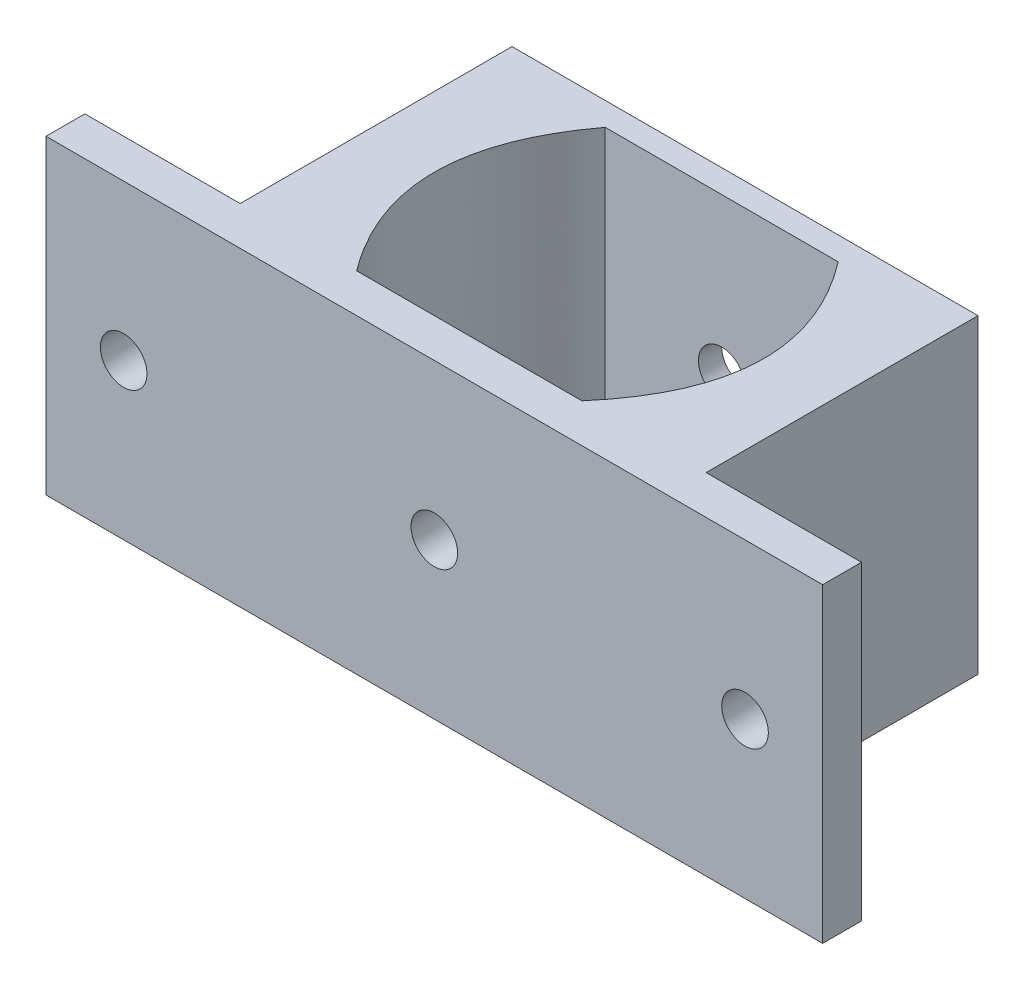
ISO-10303-21;
HEADER;
FILE_DESCRIPTION(('STEP AP214'),'2;1');
FILE_NAME('part.step','',(''),(''),'','','');
FILE_SCHEMA(('AUTOMOTIVE_DESIGN { 1 0 10303 214 1 1 1 1 }'));
ENDSEC;
DATA;
#1=APPLICATION_CONTEXT('core data for automotive mechanical design processes');
#2=APPLICATION_PROTOCOL_DEFINITION('international standard','automotive_design',2000,#1);
#3=PRODUCT_CONTEXT('',#1,'mechanical');
#4=PRODUCT('Part','Part','',(#3));
#5=PRODUCT_RELATED_PRODUCT_CATEGORY('part','',(#4));
#6=PRODUCT_DEFINITION_FORMATION('','',#4);
#7=PRODUCT_DEFINITION_CONTEXT('part definition',#1,'design');
#8=PRODUCT_DEFINITION('design','',#6,#7);
#9=PRODUCT_DEFINITION_SHAPE('','',#8);
#10=(LENGTH_UNIT() NAMED_UNIT(*) SI_UNIT(.MILLI.,.METRE.));
#11=(NAMED_UNIT(*) PLANE_ANGLE_UNIT() SI_UNIT($,.RADIAN.));
#12=(NAMED_UNIT(*) SI_UNIT($,.STERADIAN.) SOLID_ANGLE_UNIT());
#13=UNCERTAINTY_MEASURE_WITH_UNIT(LENGTH_MEASURE(1.E-05),#10,'distance_accuracy_value','');
#14=(GEOMETRIC_REPRESENTATION_CONTEXT(3) GLOBAL_UNCERTAINTY_ASSIGNED_CONTEXT((#13)) GLOBAL_UNIT_ASSIGNED_CONTEXT((#10,
#11,#12)) REPRESENTATION_CONTEXT('',''));
#15=CARTESIAN_POINT('',(0.,0.,0.));
#16=DIRECTION('',(0.,0.,1.));
#17=DIRECTION('',(1.,0.,0.));
#18=AXIS2_PLACEMENT_3D('',#15,#16,#17);
#19=CARTESIAN_POINT('',(0.,20.,0.));
#20=DIRECTION('',(0.,1.,0.));
#21=DIRECTION('',(0.,0.,1.));
#22=AXIS2_PLACEMENT_3D('',#19,#20,#21);
#23=PLANE('',#22);
#24=DIRECTION('',(1.,0.,0.));
#25=VECTOR('',#24,1.);
#26=CARTESIAN_POINT('',(0.,20.,-10.));
#27=LINE('',#26,#25);
#28=CARTESIAN_POINT('',(-13.1300199685275,20.,-10.));
#29=VERTEX_POINT('',#28);
#30=CARTESIAN_POINT('',(16.8699800314727,20.,-10.));
#31=VERTEX_POINT('',#30);
#32=EDGE_CURVE('E320',#29,#31,#27,.T.);
#33=ORIENTED_EDGE('',*,*,#32,.F.);
#34=DIRECTION('',(0.,0.,1.));
#35=VECTOR('',#34,1.);
#36=CARTESIAN_POINT('',(-13.1300199685275,20.,0.));
#37=LINE('',#36,#35);
#38=CARTESIAN_POINT('',(-13.1300199685275,20.,7.5));
#39=VERTEX_POINT('',#38);
#40=EDGE_CURVE('E323',#29,#39,#37,.T.);
#41=ORIENTED_EDGE('',*,*,#40,.T.);
#42=DIRECTION('',(1.,0.,0.));
#43=VECTOR('',#42,1.);
#44=CARTESIAN_POINT('',(-23.1300199685275,20.,7.5));
#45=LINE('',#44,#43);
#46=CARTESIAN_POINT('',(-23.1300199685275,20.,7.5));
#47=VERTEX_POINT('',#46);
#48=EDGE_CURVE('E126',#47,#39,#45,.T.);
#49=ORIENTED_EDGE('',*,*,#48,.F.);
#50=DIRECTION('',(0.,0.,1.));
#51=VECTOR('',#50,1.);
#52=CARTESIAN_POINT('',(-23.1300199685275,20.,7.5));
#53=LINE('',#52,#51);
#54=CARTESIAN_POINT('',(-23.1300199685275,20.,10.));
#55=VERTEX_POINT('',#54);
#56=EDGE_CURVE('E306',#47,#55,#53,.T.);
#57=ORIENTED_EDGE('',*,*,#56,.T.);
#58=DIRECTION('',(1.,0.,0.));
#59=VECTOR('',#58,1.);
#60=CARTESIAN_POINT('',(0.,20.,10.));
#61=LINE('',#60,#59);
#62=CARTESIAN_POINT('',(26.8699800314727,20.,10.));
#63=VERTEX_POINT('',#62);
#64=EDGE_CURVE('E326',#55,#63,#61,.T.);
#65=ORIENTED_EDGE('',*,*,#64,.T.);
#66=DIRECTION('',(0.,0.,-1.));
#67=VECTOR('',#66,1.);
#68=CARTESIAN_POINT('',(26.8699800314727,20.,10.));
#69=LINE('',#68,#67);
#70=CARTESIAN_POINT('',(26.8699800314727,20.,7.5));
#71=VERTEX_POINT('',#70);
#72=EDGE_CURVE('E292',#63,#71,#69,.T.);
#73=ORIENTED_EDGE('',*,*,#72,.T.);
#74=DIRECTION('',(-1.,0.,0.));
#75=VECTOR('',#74,1.);
#76=CARTESIAN_POINT('',(26.8699800314727,20.,7.5));
#77=LINE('',#76,#75);
#78=CARTESIAN_POINT('',(16.8699800314727,20.,7.5));
#79=VERTEX_POINT('',#78);
#80=EDGE_CURVE('E295',#71,#79,#77,.T.);
#81=ORIENTED_EDGE('',*,*,#80,.T.);
#82=DIRECTION('',(0.,0.,1.));
#83=VECTOR('',#82,1.);
#84=CARTESIAN_POINT('',(16.8699800314727,20.,0.));
#85=LINE('',#84,#83);
#86=EDGE_CURVE('E328',#31,#79,#85,.T.);
#87=ORIENTED_EDGE('',*,*,#86,.F.);
#88=EDGE_LOOP('',(#33,#41,#49,#57,#65,#73,#81,#87));
#89=FACE_BOUND('',#88,.T.);
#90=DIRECTION('',(-1.,0.,0.));
#91=VECTOR('',#90,1.);
#92=CARTESIAN_POINT('',(-8.13001996852745,20.,-8.5));
#93=LINE('',#92,#91);
#94=CARTESIAN_POINT('',(9.36998003147254,20.,-8.5));
#95=VERTEX_POINT('',#94);
#96=CARTESIAN_POINT('',(-5.63001996852745,20.,-8.5));
#97=VERTEX_POINT('',#96);
#98=EDGE_CURVE('E206',#95,#97,#93,.T.);
#99=ORIENTED_EDGE('',*,*,#98,.F.);
#100=CARTESIAN_POINT('',(9.36998003147254,20.,-8.5));
#101=CARTESIAN_POINT('',(15.6153056616661,20.,-0.325754328580209));
#102=CARTESIAN_POINT('',(8.86998003147255,20.,7.5));
#103=B_SPLINE_CURVE_WITH_KNOTS('',2,(#100,#101,#102),.UNSPECIFIED.,.F.,.F.,(3,3),(0.,1.),.UNSPECIFIED.);
#104=CARTESIAN_POINT('',(8.86998003147255,20.,7.5));
#105=VERTEX_POINT('',#104);
#106=EDGE_CURVE('E213',#95,#105,#103,.T.);
#107=ORIENTED_EDGE('',*,*,#106,.T.);
#108=DIRECTION('',(1.,0.,0.));
#109=VECTOR('',#108,1.);
#110=CARTESIAN_POINT('',(0.,20.,7.5));
#111=LINE('',#110,#109);
#112=CARTESIAN_POINT('',(-5.63001996852745,20.,7.5));
#113=VERTEX_POINT('',#112);
#114=EDGE_CURVE('E330',#113,#105,#111,.T.);
#115=ORIENTED_EDGE('',*,*,#114,.F.);
#116=CARTESIAN_POINT('',(-5.63001996852745,20.,-8.5));
#117=CARTESIAN_POINT('',(-11.6300199686239,20.,-0.5));
#118=CARTESIAN_POINT('',(-5.63001996852745,20.,7.5));
#119=B_SPLINE_CURVE_WITH_KNOTS('',2,(#116,#117,#118),.UNSPECIFIED.,.F.,.F.,(3,3),(0.,1.),.UNSPECIFIED.);
#120=EDGE_CURVE('E214',#97,#113,#119,.T.);
#121=ORIENTED_EDGE('',*,*,#120,.F.);
#122=EDGE_LOOP('',(#99,#107,#115,#121));
#123=FACE_BOUND('',#122,.T.);
#124=ADVANCED_FACE('F103',(#89,#123),#23,.T.);
#125=CARTESIAN_POINT('',(0.,0.,0.));
#126=DIRECTION('',(0.,1.,0.));
#127=DIRECTION('',(0.,0.,1.));
#128=AXIS2_PLACEMENT_3D('',#125,#126,#127);
#129=PLANE('',#128);
#130=DIRECTION('',(1.,0.,0.));
#131=VECTOR('',#130,1.);
#132=CARTESIAN_POINT('',(0.,0.,-10.));
#133=LINE('',#132,#131);
#134=CARTESIAN_POINT('',(-13.1300199685275,0.,-10.));
#135=VERTEX_POINT('',#134);
#136=CARTESIAN_POINT('',(16.8699800314727,0.,-10.));
#137=VERTEX_POINT('',#136);
#138=EDGE_CURVE('E319',#135,#137,#133,.T.);
#139=ORIENTED_EDGE('',*,*,#138,.T.);
#140=DIRECTION('',(0.,0.,1.));
#141=VECTOR('',#140,1.);
#142=CARTESIAN_POINT('',(16.8699800314727,0.,0.));
#143=LINE('',#142,#141);
#144=CARTESIAN_POINT('',(16.8699800314727,0.,7.5));
#145=VERTEX_POINT('',#144);
#146=EDGE_CURVE('E340',#137,#145,#143,.T.);
#147=ORIENTED_EDGE('',*,*,#146,.T.);
#148=DIRECTION('',(-1.,0.,0.));
#149=VECTOR('',#148,1.);
#150=CARTESIAN_POINT('',(26.8699800314727,0.,7.5));
#151=LINE('',#150,#149);
#152=CARTESIAN_POINT('',(26.8699800314727,0.,7.5));
#153=VERTEX_POINT('',#152);
#154=EDGE_CURVE('E296',#153,#145,#151,.T.);
#155=ORIENTED_EDGE('',*,*,#154,.F.);
#156=DIRECTION('',(0.,0.,-1.));
#157=VECTOR('',#156,1.);
#158=CARTESIAN_POINT('',(26.8699800314727,0.,10.));
#159=LINE('',#158,#157);
#160=CARTESIAN_POINT('',(26.8699800314727,0.,10.));
#161=VERTEX_POINT('',#160);
#162=EDGE_CURVE('E287',#161,#153,#159,.T.);
#163=ORIENTED_EDGE('',*,*,#162,.F.);
#164=DIRECTION('',(1.,0.,0.));
#165=VECTOR('',#164,1.);
#166=CARTESIAN_POINT('',(0.,0.,10.));
#167=LINE('',#166,#165);
#168=CARTESIAN_POINT('',(-23.1300199685275,0.,10.));
#169=VERTEX_POINT('',#168);
#170=EDGE_CURVE('E338',#169,#161,#167,.T.);
#171=ORIENTED_EDGE('',*,*,#170,.F.);
#172=DIRECTION('',(0.,0.,1.));
#173=VECTOR('',#172,1.);
#174=CARTESIAN_POINT('',(-23.1300199685275,0.,7.5));
#175=LINE('',#174,#173);
#176=CARTESIAN_POINT('',(-23.1300199685275,0.,7.5));
#177=VERTEX_POINT('',#176);
#178=EDGE_CURVE('E305',#177,#169,#175,.T.);
#179=ORIENTED_EDGE('',*,*,#178,.F.);
#180=DIRECTION('',(1.,0.,0.));
#181=VECTOR('',#180,1.);
#182=CARTESIAN_POINT('',(-23.1300199685275,0.,7.5));
#183=LINE('',#182,#181);
#184=CARTESIAN_POINT('',(-13.1300199685275,0.,7.5));
#185=VERTEX_POINT('',#184);
#186=EDGE_CURVE('E303',#177,#185,#183,.T.);
#187=ORIENTED_EDGE('',*,*,#186,.T.);
#188=DIRECTION('',(0.,0.,1.));
#189=VECTOR('',#188,1.);
#190=CARTESIAN_POINT('',(-13.1300199685275,0.,0.));
#191=LINE('',#190,#189);
#192=EDGE_CURVE('E335',#135,#185,#191,.T.);
#193=ORIENTED_EDGE('',*,*,#192,.F.);
#194=EDGE_LOOP('',(#139,#147,#155,#163,#171,#179,#187,#193));
#195=FACE_BOUND('',#194,.T.);
#196=CARTESIAN_POINT('',(9.36998003147254,0.,-8.5));
#197=CARTESIAN_POINT('',(15.6153056616661,0.,-0.325754328580209));
#198=CARTESIAN_POINT('',(8.86998003147255,0.,7.5));
#199=B_SPLINE_CURVE_WITH_KNOTS('',2,(#196,#197,#198),.UNSPECIFIED.,.F.,.F.,(3,3),(0.,1.),.UNSPECIFIED.);
#200=CARTESIAN_POINT('',(9.36998003147254,0.,-8.5));
#201=VERTEX_POINT('',#200);
#202=CARTESIAN_POINT('',(8.86998003147255,0.,7.5));
#203=VERTEX_POINT('',#202);
#204=EDGE_CURVE('E210',#201,#203,#199,.T.);
#205=ORIENTED_EDGE('',*,*,#204,.F.);
#206=DIRECTION('',(-1.,0.,0.));
#207=VECTOR('',#206,1.);
#208=CARTESIAN_POINT('',(-8.13001996852745,0.,-8.5));
#209=LINE('',#208,#207);
#210=CARTESIAN_POINT('',(-5.63001996852745,0.,-8.5));
#211=VERTEX_POINT('',#210);
#212=EDGE_CURVE('E194',#201,#211,#209,.T.);
#213=ORIENTED_EDGE('',*,*,#212,.T.);
#214=CARTESIAN_POINT('',(-5.63001996852745,0.,-8.5));
#215=CARTESIAN_POINT('',(-11.6300199686239,0.,-0.5));
#216=CARTESIAN_POINT('',(-5.63001996852745,0.,7.5));
#217=B_SPLINE_CURVE_WITH_KNOTS('',2,(#214,#215,#216),.UNSPECIFIED.,.F.,.F.,(3,3),(0.,1.),.UNSPECIFIED.);
#218=CARTESIAN_POINT('',(-5.63001996852745,0.,7.5));
#219=VERTEX_POINT('',#218);
#220=EDGE_CURVE('E241',#211,#219,#217,.T.);
#221=ORIENTED_EDGE('',*,*,#220,.T.);
#222=DIRECTION('',(1.,0.,0.));
#223=VECTOR('',#222,1.);
#224=CARTESIAN_POINT('',(0.,0.,7.5));
#225=LINE('',#224,#223);
#226=EDGE_CURVE('E218',#219,#203,#225,.T.);
#227=ORIENTED_EDGE('',*,*,#226,.T.);
#228=EDGE_LOOP('',(#205,#213,#221,#227));
#229=FACE_BOUND('',#228,.T.);
#230=ADVANCED_FACE('F216',(#195,#229),#129,.F.);
#231=CARTESIAN_POINT('',(0.,20.,7.5));
#232=DIRECTION('',(0.,0.,-1.));
#233=DIRECTION('',(-1.,0.,0.));
#234=AXIS2_PLACEMENT_3D('',#231,#232,#233);
#235=PLANE('',#234);
#236=ORIENTED_EDGE('',*,*,#114,.T.);
#237=DIRECTION('',(0.,1.,0.));
#238=VECTOR('',#237,1.);
#239=CARTESIAN_POINT('',(8.86998003147255,0.,7.5));
#240=LINE('',#239,#238);
#241=EDGE_CURVE('E271',#203,#105,#240,.T.);
#242=ORIENTED_EDGE('',*,*,#241,.F.);
#243=ORIENTED_EDGE('',*,*,#226,.F.);
#244=DIRECTION('',(0.,1.,0.));
#245=VECTOR('',#244,1.);
#246=CARTESIAN_POINT('',(-5.63001996852745,0.,7.5));
#247=LINE('',#246,#245);
#248=EDGE_CURVE('E252',#219,#113,#247,.T.);
#249=ORIENTED_EDGE('',*,*,#248,.T.);
#250=EDGE_LOOP('',(#236,#242,#243,#249));
#251=FACE_BOUND('',#250,.T.);
#252=CARTESIAN_POINT('',(1.8699800314726,10.,7.5));
#253=DIRECTION('',(0.,0.,-1.));
#254=DIRECTION('',(-1.,0.,0.));
#255=AXIS2_PLACEMENT_3D('',#252,#253,#254);
#256=CIRCLE('',#255,1.5);
#257=CARTESIAN_POINT('',(0.369980031472599,10.,7.5));
#258=VERTEX_POINT('',#257);
#259=EDGE_CURVE('E268',#258,#258,#256,.T.);
#260=ORIENTED_EDGE('',*,*,#259,.F.);
#261=EDGE_LOOP('',(#260));
#262=FACE_BOUND('',#261,.T.);
#263=ADVANCED_FACE('F374',(#251,#262),#235,.T.);
#264=CARTESIAN_POINT('',(-8.13001996852745,0.,-8.5));
#265=DIRECTION('',(0.,0.,-1.));
#266=DIRECTION('',(-1.,0.,0.));
#267=AXIS2_PLACEMENT_3D('',#264,#265,#266);
#268=PLANE('',#267);
#269=DIRECTION('',(0.,1.,0.));
#270=VECTOR('',#269,1.);
#271=CARTESIAN_POINT('',(-5.63001996852745,0.,-8.5));
#272=LINE('',#271,#270);
#273=EDGE_CURVE('E201',#211,#97,#272,.T.);
#274=ORIENTED_EDGE('',*,*,#273,.F.);
#275=ORIENTED_EDGE('',*,*,#212,.F.);
#276=DIRECTION('',(0.,1.,0.));
#277=VECTOR('',#276,1.);
#278=CARTESIAN_POINT('',(9.36998003147254,0.,-8.5));
#279=LINE('',#278,#277);
#280=EDGE_CURVE('E199',#201,#95,#279,.T.);
#281=ORIENTED_EDGE('',*,*,#280,.T.);
#282=ORIENTED_EDGE('',*,*,#98,.T.);
#283=EDGE_LOOP('',(#274,#275,#281,#282));
#284=FACE_BOUND('',#283,.T.);
#285=CARTESIAN_POINT('',(1.8699800314726,10.,-8.5));
#286=DIRECTION('',(0.,0.,-1.));
#287=DIRECTION('',(-1.,0.,0.));
#288=AXIS2_PLACEMENT_3D('',#285,#286,#287);
#289=CIRCLE('',#288,1.5);
#290=CARTESIAN_POINT('',(0.369980031472599,10.,-8.5));
#291=VERTEX_POINT('',#290);
#292=EDGE_CURVE('E263',#291,#291,#289,.T.);
#293=ORIENTED_EDGE('',*,*,#292,.T.);
#294=EDGE_LOOP('',(#293));
#295=FACE_BOUND('',#294,.T.);
#296=ADVANCED_FACE('F196',(#284,#295),#268,.F.);
#297=CARTESIAN_POINT('',(0.,20.,-10.));
#298=DIRECTION('',(0.,0.,-1.));
#299=DIRECTION('',(-1.,0.,0.));
#300=AXIS2_PLACEMENT_3D('',#297,#298,#299);
#301=PLANE('',#300);
#302=CARTESIAN_POINT('',(1.8699800314726,10.,-10.));
#303=DIRECTION('',(0.,0.,1.));
#304=DIRECTION('',(1.,0.,0.));
#305=AXIS2_PLACEMENT_3D('',#302,#303,#304);
#306=CIRCLE('',#305,1.5);
#307=CARTESIAN_POINT('',(3.3699800314726,10.,-10.));
#308=VERTEX_POINT('',#307);
#309=EDGE_CURVE('E260',#308,#308,#306,.T.);
#310=ORIENTED_EDGE('',*,*,#309,.T.);
#311=EDGE_LOOP('',(#310));
#312=FACE_BOUND('',#311,.T.);
#313=ORIENTED_EDGE('',*,*,#138,.F.);
#314=DIRECTION('',(0.,-1.,0.));
#315=VECTOR('',#314,1.);
#316=CARTESIAN_POINT('',(-13.1300199685275,20.,-10.));
#317=LINE('',#316,#315);
#318=EDGE_CURVE('E12',#29,#135,#317,.T.);
#319=ORIENTED_EDGE('',*,*,#318,.F.);
#320=ORIENTED_EDGE('',*,*,#32,.T.);
#321=DIRECTION('',(0.,-1.,0.));
#322=VECTOR('',#321,1.);
#323=CARTESIAN_POINT('',(16.8699800314727,20.,-10.));
#324=LINE('',#323,#322);
#325=EDGE_CURVE('E111',#31,#137,#324,.T.);
#326=ORIENTED_EDGE('',*,*,#325,.T.);
#327=EDGE_LOOP('',(#313,#319,#320,#326));
#328=FACE_BOUND('',#327,.T.);
#329=ADVANCED_FACE('F105',(#312,#328),#301,.T.);
#330=CARTESIAN_POINT('',(-13.1300199685275,20.,0.));
#331=DIRECTION('',(1.,0.,0.));
#332=DIRECTION('',(0.,0.,-1.));
#333=AXIS2_PLACEMENT_3D('',#330,#331,#332);
#334=PLANE('',#333);
#335=ORIENTED_EDGE('',*,*,#192,.T.);
#336=DIRECTION('',(0.,1.,0.));
#337=VECTOR('',#336,1.);
#338=CARTESIAN_POINT('',(-13.1300199685275,0.,7.5));
#339=LINE('',#338,#337);
#340=EDGE_CURVE('E317',#185,#39,#339,.T.);
#341=ORIENTED_EDGE('',*,*,#340,.T.);
#342=ORIENTED_EDGE('',*,*,#40,.F.);
#343=ORIENTED_EDGE('',*,*,#318,.T.);
#344=EDGE_LOOP('',(#335,#341,#342,#343));
#345=FACE_BOUND('',#344,.T.);
#346=ADVANCED_FACE('F363',(#345),#334,.F.);
#347=CARTESIAN_POINT('',(0.,20.,10.));
#348=DIRECTION('',(0.,0.,-1.));
#349=DIRECTION('',(-1.,0.,0.));
#350=AXIS2_PLACEMENT_3D('',#347,#348,#349);
#351=PLANE('',#350);
#352=CARTESIAN_POINT('',(1.8699800314726,10.,10.));
#353=DIRECTION('',(0.,0.,1.));
#354=DIRECTION('',(1.,0.,0.));
#355=AXIS2_PLACEMENT_3D('',#352,#353,#354);
#356=CIRCLE('',#355,1.5);
#357=CARTESIAN_POINT('',(3.3699800314726,10.,10.));
#358=VERTEX_POINT('',#357);
#359=EDGE_CURVE('E258',#358,#358,#356,.T.);
#360=ORIENTED_EDGE('',*,*,#359,.F.);
#361=EDGE_LOOP('',(#360));
#362=FACE_BOUND('',#361,.T.);
#363=CARTESIAN_POINT('',(21.8699800314727,9.99999999999999,10.));
#364=DIRECTION('',(0.,0.,-1.));
#365=DIRECTION('',(-1.,0.,0.));
#366=AXIS2_PLACEMENT_3D('',#363,#364,#365);
#367=CIRCLE('',#366,1.5);
#368=CARTESIAN_POINT('',(20.3699800314727,9.99999999999999,10.));
#369=VERTEX_POINT('',#368);
#370=EDGE_CURVE('E277',#369,#369,#367,.T.);
#371=ORIENTED_EDGE('',*,*,#370,.T.);
#372=EDGE_LOOP('',(#371));
#373=FACE_BOUND('',#372,.T.);
#374=CARTESIAN_POINT('',(-18.1300199685275,10.,10.));
#375=DIRECTION('',(0.,0.,-1.));
#376=DIRECTION('',(-1.,0.,0.));
#377=AXIS2_PLACEMENT_3D('',#374,#375,#376);
#378=CIRCLE('',#377,1.5);
#379=CARTESIAN_POINT('',(-19.6300199685275,10.,10.));
#380=VERTEX_POINT('',#379);
#381=EDGE_CURVE('E282',#380,#380,#378,.T.);
#382=ORIENTED_EDGE('',*,*,#381,.T.);
#383=EDGE_LOOP('',(#382));
#384=FACE_BOUND('',#383,.T.);
#385=ORIENTED_EDGE('',*,*,#170,.T.);
#386=DIRECTION('',(0.,1.,0.));
#387=VECTOR('',#386,1.);
#388=CARTESIAN_POINT('',(26.8699800314727,0.,10.));
#389=LINE('',#388,#387);
#390=EDGE_CURVE('E288',#161,#63,#389,.T.);
#391=ORIENTED_EDGE('',*,*,#390,.T.);
#392=ORIENTED_EDGE('',*,*,#64,.F.);
#393=DIRECTION('',(0.,1.,0.));
#394=VECTOR('',#393,1.);
#395=CARTESIAN_POINT('',(-23.1300199685275,0.,10.));
#396=LINE('',#395,#394);
#397=EDGE_CURVE('E314',#169,#55,#396,.T.);
#398=ORIENTED_EDGE('',*,*,#397,.F.);
#399=EDGE_LOOP('',(#385,#391,#392,#398));
#400=FACE_BOUND('',#399,.T.);
#401=ADVANCED_FACE('F352',(#362,#373,#384,#400),#351,.F.);
#402=CARTESIAN_POINT('',(16.8699800314727,20.,0.));
#403=DIRECTION('',(1.,0.,0.));
#404=DIRECTION('',(0.,0.,-1.));
#405=AXIS2_PLACEMENT_3D('',#402,#403,#404);
#406=PLANE('',#405);
#407=DIRECTION('',(0.,1.,0.));
#408=VECTOR('',#407,1.);
#409=CARTESIAN_POINT('',(16.8699800314727,0.,7.5));
#410=LINE('',#409,#408);
#411=EDGE_CURVE('E118',#145,#79,#410,.T.);
#412=ORIENTED_EDGE('',*,*,#411,.F.);
#413=ORIENTED_EDGE('',*,*,#146,.F.);
#414=ORIENTED_EDGE('',*,*,#325,.F.);
#415=ORIENTED_EDGE('',*,*,#86,.T.);
#416=EDGE_LOOP('',(#412,#413,#414,#415));
#417=FACE_BOUND('',#416,.T.);
#418=ADVANCED_FACE('F349',(#417),#406,.T.);
#419=CARTESIAN_POINT('',(-23.1300199685275,0.,7.5));
#420=DIRECTION('',(0.,0.,1.));
#421=DIRECTION('',(1.,0.,0.));
#422=AXIS2_PLACEMENT_3D('',#419,#420,#421);
#423=PLANE('',#422);
#424=CARTESIAN_POINT('',(-18.1300199685275,10.,7.5));
#425=DIRECTION('',(0.,0.,-1.));
#426=DIRECTION('',(-1.,0.,0.));
#427=AXIS2_PLACEMENT_3D('',#424,#425,#426);
#428=CIRCLE('',#427,1.5);
#429=CARTESIAN_POINT('',(-19.6300199685275,10.,7.5));
#430=VERTEX_POINT('',#429);
#431=EDGE_CURVE('E205',#430,#430,#428,.T.);
#432=ORIENTED_EDGE('',*,*,#431,.F.);
#433=EDGE_LOOP('',(#432));
#434=FACE_BOUND('',#433,.T.);
#435=ORIENTED_EDGE('',*,*,#48,.T.);
#436=ORIENTED_EDGE('',*,*,#340,.F.);
#437=ORIENTED_EDGE('',*,*,#186,.F.);
#438=DIRECTION('',(0.,1.,0.));
#439=VECTOR('',#438,1.);
#440=CARTESIAN_POINT('',(-23.1300199685275,0.,7.5));
#441=LINE('',#440,#439);
#442=EDGE_CURVE('E309',#177,#47,#441,.T.);
#443=ORIENTED_EDGE('',*,*,#442,.T.);
#444=EDGE_LOOP('',(#435,#436,#437,#443));
#445=FACE_BOUND('',#444,.T.);
#446=ADVANCED_FACE('F351',(#434,#445),#423,.F.);
#447=CARTESIAN_POINT('',(-23.1300199685275,0.,7.5));
#448=DIRECTION('',(-1.,0.,0.));
#449=DIRECTION('',(0.,0.,1.));
#450=AXIS2_PLACEMENT_3D('',#447,#448,#449);
#451=PLANE('',#450);
#452=ORIENTED_EDGE('',*,*,#56,.F.);
#453=ORIENTED_EDGE('',*,*,#442,.F.);
#454=ORIENTED_EDGE('',*,*,#178,.T.);
#455=ORIENTED_EDGE('',*,*,#397,.T.);
#456=EDGE_LOOP('',(#452,#453,#454,#455));
#457=FACE_BOUND('',#456,.T.);
#458=ADVANCED_FACE('F359',(#457),#451,.T.);
#459=CARTESIAN_POINT('',(26.8699800314727,0.,7.5));
#460=DIRECTION('',(0.,0.,-1.));
#461=DIRECTION('',(-1.,0.,0.));
#462=AXIS2_PLACEMENT_3D('',#459,#460,#461);
#463=PLANE('',#462);
#464=CARTESIAN_POINT('',(21.8699800314727,9.99999999999999,7.50000000000001));
#465=DIRECTION('',(0.,0.,-1.));
#466=DIRECTION('',(-1.,0.,0.));
#467=AXIS2_PLACEMENT_3D('',#464,#465,#466);
#468=CIRCLE('',#467,1.5);
#469=CARTESIAN_POINT('',(20.3699800314727,9.99999999999999,7.50000000000001));
#470=VERTEX_POINT('',#469);
#471=EDGE_CURVE('E274',#470,#470,#468,.T.);
#472=ORIENTED_EDGE('',*,*,#471,.F.);
#473=EDGE_LOOP('',(#472));
#474=FACE_BOUND('',#473,.T.);
#475=ORIENTED_EDGE('',*,*,#80,.F.);
#476=DIRECTION('',(0.,1.,0.));
#477=VECTOR('',#476,1.);
#478=CARTESIAN_POINT('',(26.8699800314727,0.,7.5));
#479=LINE('',#478,#477);
#480=EDGE_CURVE('E285',#153,#71,#479,.T.);
#481=ORIENTED_EDGE('',*,*,#480,.F.);
#482=ORIENTED_EDGE('',*,*,#154,.T.);
#483=ORIENTED_EDGE('',*,*,#411,.T.);
#484=EDGE_LOOP('',(#475,#481,#482,#483));
#485=FACE_BOUND('',#484,.T.);
#486=ADVANCED_FACE('F405',(#474,#485),#463,.T.);
#487=CARTESIAN_POINT('',(26.8699800314727,0.,10.));
#488=DIRECTION('',(1.,0.,0.));
#489=DIRECTION('',(0.,0.,-1.));
#490=AXIS2_PLACEMENT_3D('',#487,#488,#489);
#491=PLANE('',#490);
#492=ORIENTED_EDGE('',*,*,#72,.F.);
#493=ORIENTED_EDGE('',*,*,#390,.F.);
#494=ORIENTED_EDGE('',*,*,#162,.T.);
#495=ORIENTED_EDGE('',*,*,#480,.T.);
#496=EDGE_LOOP('',(#492,#493,#494,#495));
#497=FACE_BOUND('',#496,.T.);
#498=ADVANCED_FACE('F402',(#497),#491,.T.);
#499=CARTESIAN_POINT('',(21.8699800314727,9.99999999999999,10.5));
#500=DIRECTION('',(0.,0.,-1.));
#501=DIRECTION('',(-1.,0.,0.));
#502=AXIS2_PLACEMENT_3D('',#499,#500,#501);
#503=CYLINDRICAL_SURFACE('',#502,1.5);
#504=ORIENTED_EDGE('',*,*,#471,.T.);
#505=EDGE_LOOP('',(#504));
#506=FACE_BOUND('',#505,.T.);
#507=ORIENTED_EDGE('',*,*,#370,.F.);
#508=EDGE_LOOP('',(#507));
#509=FACE_BOUND('',#508,.T.);
#510=ADVANCED_FACE('F636',(#506,#509),#503,.F.);
#511=CARTESIAN_POINT('',(-18.1300199685275,10.,10.5));
#512=DIRECTION('',(0.,0.,-1.));
#513=DIRECTION('',(-1.,0.,0.));
#514=AXIS2_PLACEMENT_3D('',#511,#512,#513);
#515=CYLINDRICAL_SURFACE('',#514,1.5);
#516=ORIENTED_EDGE('',*,*,#431,.T.);
#517=EDGE_LOOP('',(#516));
#518=FACE_BOUND('',#517,.T.);
#519=ORIENTED_EDGE('',*,*,#381,.F.);
#520=EDGE_LOOP('',(#519));
#521=FACE_BOUND('',#520,.T.);
#522=ADVANCED_FACE('F389',(#518,#521),#515,.F.);
#523=CARTESIAN_POINT('',(1.8699800314726,10.,-10.));
#524=DIRECTION('',(0.,0.,1.));
#525=DIRECTION('',(1.,0.,0.));
#526=AXIS2_PLACEMENT_3D('',#523,#524,#525);
#527=CYLINDRICAL_SURFACE('',#526,1.5);
#528=ORIENTED_EDGE('',*,*,#259,.T.);
#529=EDGE_LOOP('',(#528));
#530=FACE_BOUND('',#529,.T.);
#531=ORIENTED_EDGE('',*,*,#359,.T.);
#532=EDGE_LOOP('',(#531));
#533=FACE_BOUND('',#532,.T.);
#534=ADVANCED_FACE('F239',(#530,#533),#527,.F.);
#535=ORIENTED_EDGE('',*,*,#309,.F.);
#536=EDGE_LOOP('',(#535));
#537=FACE_BOUND('',#536,.T.);
#538=ORIENTED_EDGE('',*,*,#292,.F.);
#539=EDGE_LOOP('',(#538));
#540=FACE_BOUND('',#539,.T.);
#541=ADVANCED_FACE('F237',(#537,#540),#527,.F.);
#542=DIRECTION('',(0.,1.,0.));
#543=VECTOR('',#542,1.);
#544=SURFACE_OF_LINEAR_EXTRUSION('',#217,#543);
#545=ORIENTED_EDGE('',*,*,#120,.T.);
#546=ORIENTED_EDGE('',*,*,#248,.F.);
#547=ORIENTED_EDGE('',*,*,#220,.F.);
#548=ORIENTED_EDGE('',*,*,#273,.T.);
#549=EDGE_LOOP('',(#545,#546,#547,#548));
#550=FACE_BOUND('',#549,.T.);
#551=ADVANCED_FACE('F233',(#550),#544,.F.);
#552=DIRECTION('',(0.,1.,0.));
#553=VECTOR('',#552,1.);
#554=SURFACE_OF_LINEAR_EXTRUSION('',#199,#553);
#555=ORIENTED_EDGE('',*,*,#106,.F.);
#556=ORIENTED_EDGE('',*,*,#280,.F.);
#557=ORIENTED_EDGE('',*,*,#204,.T.);
#558=ORIENTED_EDGE('',*,*,#241,.T.);
#559=EDGE_LOOP('',(#555,#556,#557,#558));
#560=FACE_BOUND('',#559,.T.);
#561=ADVANCED_FACE('F209',(#560),#554,.T.);
#562=CLOSED_SHELL('',(#124,#230,#263,#296,#329,#346,#401,#418,#446,#458,#486,#498,#510,#522,
#534,#541,#551,#561));
#563=MANIFOLD_SOLID_BREP('B2',#562);
#564=ADVANCED_BREP_SHAPE_REPRESENTATION('',(#18,#563),#14);
#565=SHAPE_DEFINITION_REPRESENTATION(#9,#564);
ENDSEC;
END-ISO-10303-21;
